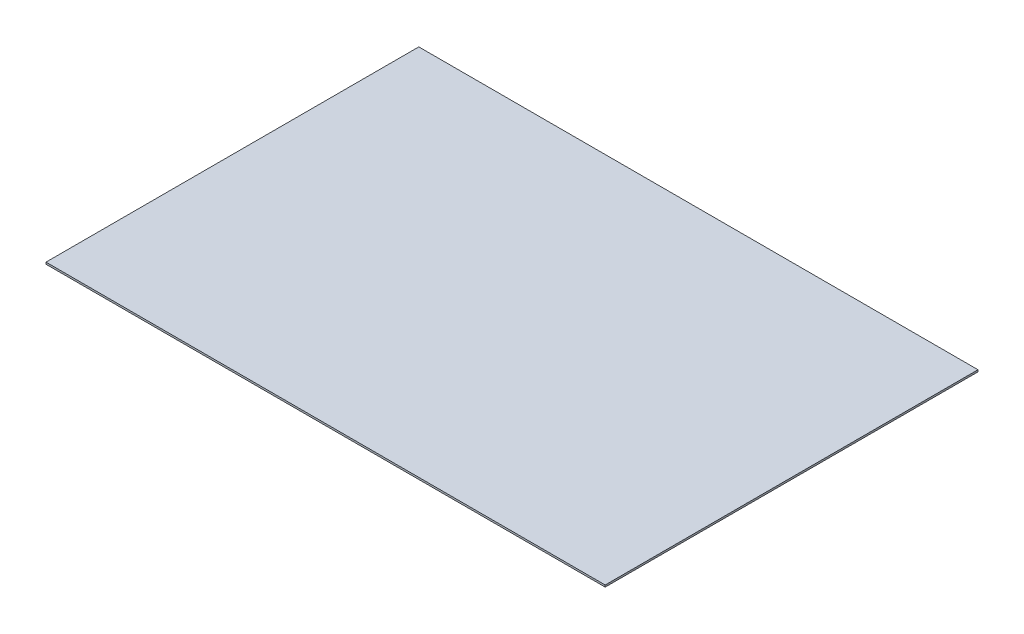
ISO-10303-21;
HEADER;
FILE_DESCRIPTION(('STEP AP214'),'2;1');
FILE_NAME('part.step','',(''),(''),'','','');
FILE_SCHEMA(('AUTOMOTIVE_DESIGN { 1 0 10303 214 1 1 1 1 }'));
ENDSEC;
DATA;
#1=APPLICATION_CONTEXT('core data for automotive mechanical design processes');
#2=APPLICATION_PROTOCOL_DEFINITION('international standard','automotive_design',2000,#1);
#3=PRODUCT_CONTEXT('',#1,'mechanical');
#4=PRODUCT('Part','Part','',(#3));
#5=PRODUCT_RELATED_PRODUCT_CATEGORY('part','',(#4));
#6=PRODUCT_DEFINITION_FORMATION('','',#4);
#7=PRODUCT_DEFINITION_CONTEXT('part definition',#1,'design');
#8=PRODUCT_DEFINITION('design','',#6,#7);
#9=PRODUCT_DEFINITION_SHAPE('','',#8);
#10=(LENGTH_UNIT() NAMED_UNIT(*) SI_UNIT(.MILLI.,.METRE.));
#11=(NAMED_UNIT(*) PLANE_ANGLE_UNIT() SI_UNIT($,.RADIAN.));
#12=(NAMED_UNIT(*) SI_UNIT($,.STERADIAN.) SOLID_ANGLE_UNIT());
#13=UNCERTAINTY_MEASURE_WITH_UNIT(LENGTH_MEASURE(1.E-05),#10,'distance_accuracy_value','');
#14=(GEOMETRIC_REPRESENTATION_CONTEXT(3) GLOBAL_UNCERTAINTY_ASSIGNED_CONTEXT((#13)) GLOBAL_UNIT_ASSIGNED_CONTEXT((#10,
#11,#12)) REPRESENTATION_CONTEXT('',''));
#15=CARTESIAN_POINT('',(0.,0.,0.));
#16=DIRECTION('',(0.,0.,1.));
#17=DIRECTION('',(1.,0.,0.));
#18=AXIS2_PLACEMENT_3D('',#15,#16,#17);
#19=CARTESIAN_POINT('',(0.,2.,0.));
#20=DIRECTION('',(-1.,0.,0.));
#21=DIRECTION('',(0.,0.,1.));
#22=AXIS2_PLACEMENT_3D('',#19,#20,#21);
#23=PLANE('',#22);
#24=DIRECTION('',(0.,0.,-1.));
#25=VECTOR('',#24,1.);
#26=CARTESIAN_POINT('',(0.,0.,0.));
#27=LINE('',#26,#25);
#28=CARTESIAN_POINT('',(0.,0.,0.));
#29=VERTEX_POINT('',#28);
#30=CARTESIAN_POINT('',(-1.2490009027033E-13,0.,-400.));
#31=VERTEX_POINT('',#30);
#32=EDGE_CURVE('E103',#29,#31,#27,.T.);
#33=ORIENTED_EDGE('',*,*,#32,.F.);
#34=DIRECTION('',(0.,-1.,0.));
#35=VECTOR('',#34,1.);
#36=CARTESIAN_POINT('',(0.,2.,0.));
#37=LINE('',#36,#35);
#38=CARTESIAN_POINT('',(0.,2.,0.));
#39=VERTEX_POINT('',#38);
#40=EDGE_CURVE('E11',#39,#29,#37,.T.);
#41=ORIENTED_EDGE('',*,*,#40,.F.);
#42=DIRECTION('',(0.,0.,-1.));
#43=VECTOR('',#42,1.);
#44=CARTESIAN_POINT('',(0.,2.,0.));
#45=LINE('',#44,#43);
#46=CARTESIAN_POINT('',(-1.2490009027033E-13,2.,-400.));
#47=VERTEX_POINT('',#46);
#48=EDGE_CURVE('E98',#39,#47,#45,.T.);
#49=ORIENTED_EDGE('',*,*,#48,.T.);
#50=DIRECTION('',(0.,-1.,0.));
#51=VECTOR('',#50,1.);
#52=CARTESIAN_POINT('',(-1.2490009027033E-13,2.,-400.));
#53=LINE('',#52,#51);
#54=EDGE_CURVE('E41',#47,#31,#53,.T.);
#55=ORIENTED_EDGE('',*,*,#54,.T.);
#56=EDGE_LOOP('',(#33,#41,#49,#55));
#57=FACE_BOUND('',#56,.T.);
#58=ADVANCED_FACE('F38',(#57),#23,.T.);
#59=CARTESIAN_POINT('',(0.,2.,0.));
#60=DIRECTION('',(0.,0.,-1.));
#61=DIRECTION('',(-1.,0.,0.));
#62=AXIS2_PLACEMENT_3D('',#59,#60,#61);
#63=PLANE('',#62);
#64=DIRECTION('',(1.,0.,0.));
#65=VECTOR('',#64,1.);
#66=CARTESIAN_POINT('',(0.,0.,0.));
#67=LINE('',#66,#65);
#68=CARTESIAN_POINT('',(600.,0.,0.));
#69=VERTEX_POINT('',#68);
#70=EDGE_CURVE('E71',#29,#69,#67,.T.);
#71=ORIENTED_EDGE('',*,*,#70,.T.);
#72=DIRECTION('',(0.,-1.,0.));
#73=VECTOR('',#72,1.);
#74=CARTESIAN_POINT('',(600.,2.,0.));
#75=LINE('',#74,#73);
#76=CARTESIAN_POINT('',(600.,2.,0.));
#77=VERTEX_POINT('',#76);
#78=EDGE_CURVE('E47',#77,#69,#75,.T.);
#79=ORIENTED_EDGE('',*,*,#78,.F.);
#80=DIRECTION('',(1.,0.,0.));
#81=VECTOR('',#80,1.);
#82=CARTESIAN_POINT('',(0.,2.,0.));
#83=LINE('',#82,#81);
#84=EDGE_CURVE('E88',#39,#77,#83,.T.);
#85=ORIENTED_EDGE('',*,*,#84,.F.);
#86=ORIENTED_EDGE('',*,*,#40,.T.);
#87=EDGE_LOOP('',(#71,#79,#85,#86));
#88=FACE_BOUND('',#87,.T.);
#89=ADVANCED_FACE('F113',(#88),#63,.F.);
#90=CARTESIAN_POINT('',(600.,2.,0.));
#91=DIRECTION('',(-1.,0.,0.));
#92=DIRECTION('',(0.,0.,1.));
#93=AXIS2_PLACEMENT_3D('',#90,#91,#92);
#94=PLANE('',#93);
#95=DIRECTION('',(0.,0.,-1.));
#96=VECTOR('',#95,1.);
#97=CARTESIAN_POINT('',(600.,0.,0.));
#98=LINE('',#97,#96);
#99=CARTESIAN_POINT('',(600.,0.,-400.));
#100=VERTEX_POINT('',#99);
#101=EDGE_CURVE('E95',#69,#100,#98,.T.);
#102=ORIENTED_EDGE('',*,*,#101,.T.);
#103=DIRECTION('',(0.,-1.,0.));
#104=VECTOR('',#103,1.);
#105=CARTESIAN_POINT('',(600.,2.,-400.));
#106=LINE('',#105,#104);
#107=CARTESIAN_POINT('',(600.,2.,-400.));
#108=VERTEX_POINT('',#107);
#109=EDGE_CURVE('E92',#108,#100,#106,.T.);
#110=ORIENTED_EDGE('',*,*,#109,.F.);
#111=DIRECTION('',(0.,0.,-1.));
#112=VECTOR('',#111,1.);
#113=CARTESIAN_POINT('',(600.,2.,0.));
#114=LINE('',#113,#112);
#115=EDGE_CURVE('E83',#77,#108,#114,.T.);
#116=ORIENTED_EDGE('',*,*,#115,.F.);
#117=ORIENTED_EDGE('',*,*,#78,.T.);
#118=EDGE_LOOP('',(#102,#110,#116,#117));
#119=FACE_BOUND('',#118,.T.);
#120=ADVANCED_FACE('F93',(#119),#94,.F.);
#121=CARTESIAN_POINT('',(-1.2490009027033E-13,2.,-400.));
#122=DIRECTION('',(0.,0.,-1.));
#123=DIRECTION('',(-1.,0.,0.));
#124=AXIS2_PLACEMENT_3D('',#121,#122,#123);
#125=PLANE('',#124);
#126=DIRECTION('',(1.,0.,0.));
#127=VECTOR('',#126,1.);
#128=CARTESIAN_POINT('',(-1.2490009027033E-13,0.,-400.));
#129=LINE('',#128,#127);
#130=EDGE_CURVE('E106',#31,#100,#129,.T.);
#131=ORIENTED_EDGE('',*,*,#130,.F.);
#132=ORIENTED_EDGE('',*,*,#54,.F.);
#133=DIRECTION('',(1.,0.,0.));
#134=VECTOR('',#133,1.);
#135=CARTESIAN_POINT('',(-1.2490009027033E-13,2.,-400.));
#136=LINE('',#135,#134);
#137=EDGE_CURVE('E87',#47,#108,#136,.T.);
#138=ORIENTED_EDGE('',*,*,#137,.T.);
#139=ORIENTED_EDGE('',*,*,#109,.T.);
#140=EDGE_LOOP('',(#131,#132,#138,#139));
#141=FACE_BOUND('',#140,.T.);
#142=ADVANCED_FACE('F97',(#141),#125,.T.);
#143=CARTESIAN_POINT('',(0.,2.,0.));
#144=DIRECTION('',(0.,-1.,0.));
#145=DIRECTION('',(0.,0.,-1.));
#146=AXIS2_PLACEMENT_3D('',#143,#144,#145);
#147=PLANE('',#146);
#148=ORIENTED_EDGE('',*,*,#48,.F.);
#149=ORIENTED_EDGE('',*,*,#84,.T.);
#150=ORIENTED_EDGE('',*,*,#115,.T.);
#151=ORIENTED_EDGE('',*,*,#137,.F.);
#152=EDGE_LOOP('',(#148,#149,#150,#151));
#153=FACE_BOUND('',#152,.T.);
#154=ADVANCED_FACE('F86',(#153),#147,.F.);
#155=CARTESIAN_POINT('',(0.,0.,0.));
#156=DIRECTION('',(0.,-1.,0.));
#157=DIRECTION('',(0.,0.,-1.));
#158=AXIS2_PLACEMENT_3D('',#155,#156,#157);
#159=PLANE('',#158);
#160=ORIENTED_EDGE('',*,*,#32,.T.);
#161=ORIENTED_EDGE('',*,*,#130,.T.);
#162=ORIENTED_EDGE('',*,*,#101,.F.);
#163=ORIENTED_EDGE('',*,*,#70,.F.);
#164=EDGE_LOOP('',(#160,#161,#162,#163));
#165=FACE_BOUND('',#164,.T.);
#166=ADVANCED_FACE('F111',(#165),#159,.T.);
#167=CLOSED_SHELL('',(#58,#89,#120,#142,#154,#166));
#168=MANIFOLD_SOLID_BREP('B2',#167);
#169=ADVANCED_BREP_SHAPE_REPRESENTATION('',(#18,#168),#14);
#170=SHAPE_DEFINITION_REPRESENTATION(#9,#169);
ENDSEC;
END-ISO-10303-21;
